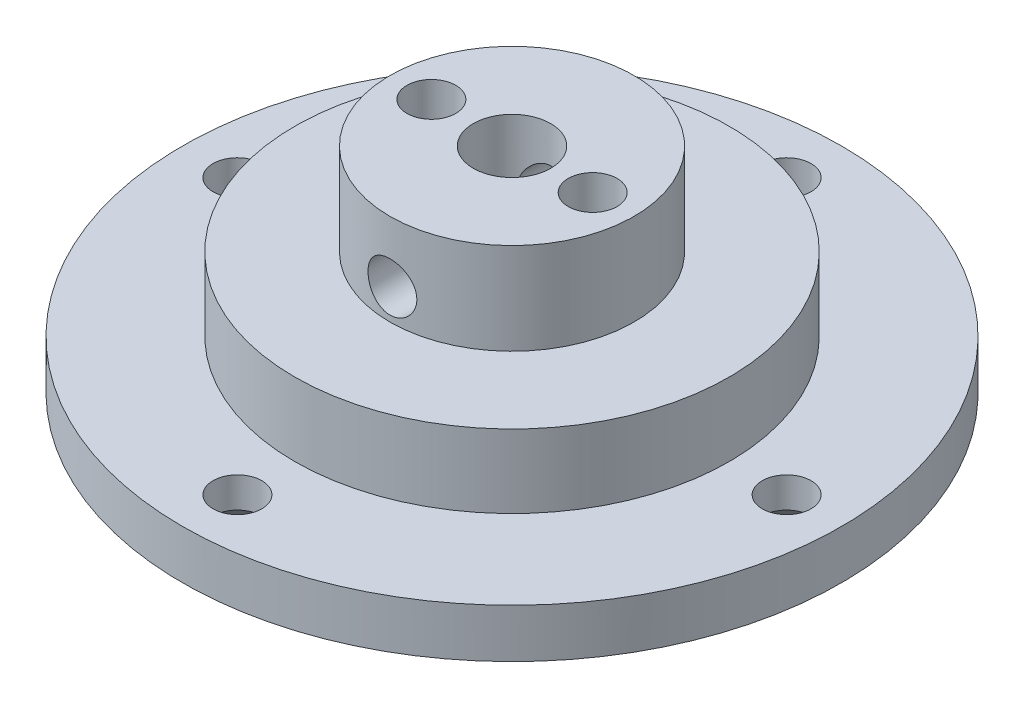
ISO-10303-21;
HEADER;
FILE_DESCRIPTION(('STEP AP214'),'2;1');
FILE_NAME('part.step','',(''),(''),'','','');
FILE_SCHEMA(('AUTOMOTIVE_DESIGN { 1 0 10303 214 1 1 1 1 }'));
ENDSEC;
DATA;
#1=APPLICATION_CONTEXT('core data for automotive mechanical design processes');
#2=APPLICATION_PROTOCOL_DEFINITION('international standard','automotive_design',2000,#1);
#3=PRODUCT_CONTEXT('',#1,'mechanical');
#4=PRODUCT('Part','Part','',(#3));
#5=PRODUCT_RELATED_PRODUCT_CATEGORY('part','',(#4));
#6=PRODUCT_DEFINITION_FORMATION('','',#4);
#7=PRODUCT_DEFINITION_CONTEXT('part definition',#1,'design');
#8=PRODUCT_DEFINITION('design','',#6,#7);
#9=PRODUCT_DEFINITION_SHAPE('','',#8);
#10=(LENGTH_UNIT() NAMED_UNIT(*) SI_UNIT(.MILLI.,.METRE.));
#11=(NAMED_UNIT(*) PLANE_ANGLE_UNIT() SI_UNIT($,.RADIAN.));
#12=(NAMED_UNIT(*) SI_UNIT($,.STERADIAN.) SOLID_ANGLE_UNIT());
#13=UNCERTAINTY_MEASURE_WITH_UNIT(LENGTH_MEASURE(1.E-05),#10,'distance_accuracy_value','');
#14=(GEOMETRIC_REPRESENTATION_CONTEXT(3) GLOBAL_UNCERTAINTY_ASSIGNED_CONTEXT((#13)) GLOBAL_UNIT_ASSIGNED_CONTEXT((#10,
#11,#12)) REPRESENTATION_CONTEXT('',''));
#15=CARTESIAN_POINT('',(0.,0.,0.));
#16=DIRECTION('',(0.,0.,1.));
#17=DIRECTION('',(1.,0.,0.));
#18=AXIS2_PLACEMENT_3D('',#15,#16,#17);
#19=CARTESIAN_POINT('',(0.,16.,0.));
#20=DIRECTION('',(0.,-1.,0.));
#21=DIRECTION('',(0.,0.,-1.));
#22=AXIS2_PLACEMENT_3D('',#19,#20,#21);
#23=CYLINDRICAL_SURFACE('',#22,27.);
#24=CARTESIAN_POINT('',(0.,2.5,0.));
#25=DIRECTION('',(0.,1.,0.));
#26=DIRECTION('',(0.,0.,1.));
#27=AXIS2_PLACEMENT_3D('',#24,#25,#26);
#28=CIRCLE('',#27,27.);
#29=CARTESIAN_POINT('',(0.,2.5,27.));
#30=VERTEX_POINT('',#29);
#31=EDGE_CURVE('E149',#30,#30,#28,.T.);
#32=ORIENTED_EDGE('',*,*,#31,.F.);
#33=EDGE_LOOP('',(#32));
#34=FACE_BOUND('',#33,.T.);
#35=CARTESIAN_POINT('',(0.,-1.5,0.));
#36=DIRECTION('',(0.,-1.,0.));
#37=DIRECTION('',(0.,0.,-1.));
#38=AXIS2_PLACEMENT_3D('',#35,#36,#37);
#39=CIRCLE('',#38,27.);
#40=CARTESIAN_POINT('',(0.,-1.5,-27.));
#41=VERTEX_POINT('',#40);
#42=EDGE_CURVE('E73',#41,#41,#39,.T.);
#43=ORIENTED_EDGE('',*,*,#42,.F.);
#44=EDGE_LOOP('',(#43));
#45=FACE_BOUND('',#44,.T.);
#46=ADVANCED_FACE('F29',(#34,#45),#23,.T.);
#47=CARTESIAN_POINT('',(0.,8.5,0.));
#48=DIRECTION('',(0.,1.,0.));
#49=DIRECTION('',(0.,0.,1.));
#50=AXIS2_PLACEMENT_3D('',#47,#48,#49);
#51=PLANE('',#50);
#52=CARTESIAN_POINT('',(0.,8.5,0.));
#53=DIRECTION('',(0.,1.,0.));
#54=DIRECTION('',(0.,0.,1.));
#55=AXIS2_PLACEMENT_3D('',#52,#53,#54);
#56=CIRCLE('',#55,10.);
#57=CARTESIAN_POINT('',(0.,8.5,10.));
#58=VERTEX_POINT('',#57);
#59=EDGE_CURVE('E141',#58,#58,#56,.T.);
#60=ORIENTED_EDGE('',*,*,#59,.F.);
#61=EDGE_LOOP('',(#60));
#62=FACE_BOUND('',#61,.T.);
#63=CARTESIAN_POINT('',(0.,8.5,0.));
#64=DIRECTION('',(0.,1.,0.));
#65=DIRECTION('',(0.,0.,1.));
#66=AXIS2_PLACEMENT_3D('',#63,#64,#65);
#67=CIRCLE('',#66,17.8);
#68=CARTESIAN_POINT('',(0.,8.5,17.8));
#69=VERTEX_POINT('',#68);
#70=EDGE_CURVE('E144',#69,#69,#67,.T.);
#71=ORIENTED_EDGE('',*,*,#70,.T.);
#72=EDGE_LOOP('',(#71));
#73=FACE_BOUND('',#72,.T.);
#74=ADVANCED_FACE('F127',(#62,#73),#51,.T.);
#75=CARTESIAN_POINT('',(0.,16.,0.));
#76=DIRECTION('',(0.,-1.,0.));
#77=DIRECTION('',(0.,0.,-1.));
#78=AXIS2_PLACEMENT_3D('',#75,#76,#77);
#79=CYLINDRICAL_SURFACE('',#78,3.175);
#80=CARTESIAN_POINT('',(0.,13.,-3.175));
#81=CARTESIAN_POINT('',(-0.101476525037058,12.9999915738684,-3.17499226289299));
#82=CARTESIAN_POINT('',(-0.203070052510219,12.9922243293759,-3.17008417823695));
#83=CARTESIAN_POINT('',(-0.403126766571678,12.9615745462042,-3.15091460168315));
#84=CARTESIAN_POINT('',(-0.501584012256517,12.9386649238897,-3.13663635064563));
#85=CARTESIAN_POINT('',(-0.692090634849497,12.8790753842645,-3.10016098732322));
#86=CARTESIAN_POINT('',(-0.784169067111647,12.8424635448291,-3.07800305101176));
#87=CARTESIAN_POINT('',(-0.960549971137719,12.7569746718291,-3.02760547522689));
#88=CARTESIAN_POINT('',(-1.04485310574213,12.7080986851016,-2.99936635485732));
#89=CARTESIAN_POINT('',(-1.2109639704167,12.5951346292733,-2.93644329633053));
#90=CARTESIAN_POINT('',(-1.29202459435627,12.5301387524063,-2.90142355627336));
#91=CARTESIAN_POINT('',(-1.44281789047478,12.3888742010404,-2.82946962284188));
#92=CARTESIAN_POINT('',(-1.51253493436166,12.3125902462452,-2.79253287918862));
#93=CARTESIAN_POINT('',(-1.64846069913404,12.1385956769623,-2.71479906783721));
#94=CARTESIAN_POINT('',(-1.71285716373584,12.0393809282853,-2.67417281468809));
#95=CARTESIAN_POINT('',(-1.82388334104334,11.8291657733324,-2.59972200280474));
#96=CARTESIAN_POINT('',(-1.87054322812345,11.7181857978822,-2.56588593898158));
#97=CARTESIAN_POINT('',(-1.93404005976775,11.5171939413814,-2.51818564470656));
#98=CARTESIAN_POINT('',(-1.95549189401937,11.4293358645121,-2.50140969328061));
#99=CARTESIAN_POINT('',(-1.9863405193127,11.2503385388876,-2.47698936531946));
#100=CARTESIAN_POINT('',(-1.99575475877688,11.1592042365963,-2.46933177288691));
#101=CARTESIAN_POINT('',(-2.00196100490322,10.9759576185273,-2.46430468488944));
#102=CARTESIAN_POINT('',(-1.99871804869056,10.8838432956427,-2.46696368665383));
#103=CARTESIAN_POINT('',(-1.97975435108006,10.701720479503,-2.48220365208432));
#104=CARTESIAN_POINT('',(-1.96402350468153,10.6117137524284,-2.49479265089232));
#105=CARTESIAN_POINT('',(-1.92154408819563,10.4383552262731,-2.52764357716514));
#106=CARTESIAN_POINT('',(-1.89508126789267,10.354893221663,-2.54770547926273));
#107=CARTESIAN_POINT('',(-1.83220192270645,10.1934318752372,-2.59329248142859));
#108=CARTESIAN_POINT('',(-1.79578189681142,10.1154344669459,-2.61881950237853));
#109=CARTESIAN_POINT('',(-1.70611370468259,9.95143635722466,-2.67828449369144));
#110=CARTESIAN_POINT('',(-1.65098588782389,9.86670982353849,-2.712900245592));
#111=CARTESIAN_POINT('',(-1.52895400605439,9.70677368229887,-2.78350606267571));
#112=CARTESIAN_POINT('',(-1.46203770576499,9.63157410364516,-2.81949752503149));
#113=CARTESIAN_POINT('',(-1.30487665200941,9.47974505690309,-2.89599631992292));
#114=CARTESIAN_POINT('',(-1.21259971177505,9.40505594095576,-2.93622794327932));
#115=CARTESIAN_POINT('',(-1.01448876791333,9.27228293876362,-3.01041623037065));
#116=CARTESIAN_POINT('',(-0.908659634525412,9.21419311136341,-3.04437513767011));
#117=CARTESIAN_POINT('',(-0.691622427030107,9.11986385845807,-3.1006744181714));
#118=CARTESIAN_POINT('',(-0.580977452615208,9.08264796143226,-3.12352576206067));
#119=CARTESIAN_POINT('',(-0.353219543278324,9.02797212410483,-3.15737991805264));
#120=CARTESIAN_POINT('',(-0.23611632638235,9.01048330675241,-3.16840004787418));
#121=CARTESIAN_POINT('',(-0.0180413733491916,8.99756070451699,-3.1765355644463));
#122=CARTESIAN_POINT('',(0.0826993681605531,8.99919818567427,-3.17549752338765));
#123=CARTESIAN_POINT('',(0.282251535700953,9.01748525155895,-3.16400646666093));
#124=CARTESIAN_POINT('',(0.381063114978562,9.03413363886638,-3.15355420196555));
#125=CARTESIAN_POINT('',(0.569785789390975,9.08052175099713,-3.12485337509414));
#126=CARTESIAN_POINT('',(0.659896585711474,9.10967756599563,-3.10695351243135));
#127=CARTESIAN_POINT('',(0.833839239568702,9.17969535941149,-3.06485767127365));
#128=CARTESIAN_POINT('',(0.917670073048523,9.22055924181343,-3.04066066878657));
#129=CARTESIAN_POINT('',(1.08579010212587,9.31732672258559,-2.98501096062797));
#130=CARTESIAN_POINT('',(1.16928557007131,9.37432618195949,-2.95307446884992));
#131=CARTESIAN_POINT('',(1.32610017982497,9.49948604525303,-2.88606502180744));
#132=CARTESIAN_POINT('',(1.39940803331593,9.56765865013628,-2.85098865705074));
#133=CARTESIAN_POINT('',(1.5450195333334,9.72483957438977,-2.77510866590551));
#134=CARTESIAN_POINT('',(1.61557264573246,9.81543821418124,-2.73422493399918));
#135=CARTESIAN_POINT('',(1.74075576106748,10.0085425655102,-2.65628150074483));
#136=CARTESIAN_POINT('',(1.79539548284394,10.1110409557417,-2.61921947432595));
#137=CARTESIAN_POINT('',(1.87731719418663,10.3041017371923,-2.56091666468433));
#138=CARTESIAN_POINT('',(1.90792193981148,10.3927367080239,-2.5379888591193));
#139=CARTESIAN_POINT('',(1.95660261704509,10.5750569027745,-2.50065678385652));
#140=CARTESIAN_POINT('',(1.97469844769937,10.6687338488617,-2.48623898190295));
#141=CARTESIAN_POINT('',(1.99736898375345,10.8593757964664,-2.46807030692743));
#142=CARTESIAN_POINT('',(2.00186040231689,10.9563573904095,-2.46438514488327));
#143=CARTESIAN_POINT('',(1.99673295842469,11.1497139848567,-2.46854006574368));
#144=CARTESIAN_POINT('',(1.98711028907932,11.2460888146605,-2.47638325810819));
#145=CARTESIAN_POINT('',(1.95590161091486,11.4267584358958,-2.50108241635968));
#146=CARTESIAN_POINT('',(1.9354349287763,11.5113727596774,-2.51709058194002));
#147=CARTESIAN_POINT('',(1.88430589785023,11.6758845942376,-2.55558918617021));
#148=CARTESIAN_POINT('',(1.85363913716578,11.7557800462964,-2.57808242928518));
#149=CARTESIAN_POINT('',(1.77802954743066,11.9208620212196,-2.63090189354455));
#150=CARTESIAN_POINT('',(1.73167768941996,12.0051882645014,-2.66188689358514));
#151=CARTESIAN_POINT('',(1.62798716761765,12.1656760953991,-2.72654071214852));
#152=CARTESIAN_POINT('',(1.57063976998898,12.2418311170513,-2.76021165163326));
#153=CARTESIAN_POINT('',(1.43290771955615,12.3999635167176,-2.83455450899614));
#154=CARTESIAN_POINT('',(1.35021039869714,12.4799370514052,-2.87524740651978));
#155=CARTESIAN_POINT('',(1.17116070071825,12.625330698229,-2.9527186029575));
#156=CARTESIAN_POINT('',(1.07479913792041,12.6907409436617,-2.98949423916137));
#157=CARTESIAN_POINT('',(0.869021324089803,12.805194128567,-3.05567422341638));
#158=CARTESIAN_POINT('',(0.759495717250583,12.8540849770325,-3.08500948592018));
#159=CARTESIAN_POINT('',(0.588629915706879,12.9123666835811,-3.12050401388052));
#160=CARTESIAN_POINT('',(0.530633997223153,12.9292762893588,-3.13091186629432));
#161=CARTESIAN_POINT('',(0.412912445199532,12.9578460555983,-3.14859608649339));
#162=CARTESIAN_POINT('',(0.353188086098299,12.9695099839518,-3.15587470179684));
#163=CARTESIAN_POINT('',(0.244573633037735,12.9855912771478,-3.16593862131482));
#164=CARTESIAN_POINT('',(0.195881568934531,12.9909865535109,-3.1693284738155));
#165=CARTESIAN_POINT('',(0.0981354745406985,12.9981930587294,-3.17386110076005));
#166=CARTESIAN_POINT('',(0.0490814230021905,13.0000040754897,-3.1750037422273));
#167=CARTESIAN_POINT('',(0.,13.,-3.175));
#168=B_SPLINE_CURVE_WITH_KNOTS('',3,(#80,#81,#82,#83,#84,#85,#86,#87,#88,#89,#90,#91,#92,#93,
#94,#95,#96,#97,#98,#99,#100,#101,#102,#103,#104,#105,#106,#107,#108,#109,#110,#111,#112,#113,
#114,#115,#116,#117,#118,#119,#120,#121,#122,#123,#124,#125,#126,#127,#128,#129,#130,#131,#132,
#133,#134,#135,#136,#137,#138,#139,#140,#141,#142,#143,#144,#145,#146,#147,#148,#149,#150,#151,
#152,#153,#154,#155,#156,#157,#158,#159,#160,#161,#162,#163,#164,#165,#166,#167),.UNSPECIFIED.,
.T.,.F.,(4,2,2,2,2,2,2,2,2,2,2,2,2,2,2,2,2,2,2,2,2,2,2,2,2,2,2,2,2,2,2,2,2,2,2,2,2,2,2,2,2,2,2,
4),(0.,0.304232392052239,0.609010411584713,0.912293856546583,1.21555142279238,1.5432197260186,
1.87133571080326,2.24473770562467,2.61750157607975,2.89230792913177,3.16671549876435,
3.44188159806796,3.7172705846124,3.9857637675447,4.25435147593007,4.57371032212574,
4.89340260802561,5.26757704232499,5.64161738528108,5.99627086908168,6.35040452472408,
6.65112338712867,6.95181826331198,7.23978633358548,7.52780126029116,7.84463984501204,
8.16182674815677,8.52590386283171,8.88975815489272,9.17822046878512,9.46622283736116,
9.75598484184772,10.0458250160945,10.310328368308,10.5749462767354,10.8771490479437,
11.1795928629566,11.5440020655339,11.9086574109828,12.2765839914835,12.4602144397249,
12.6437127774711,12.7908529677973,12.9380018647449),.UNSPECIFIED.);
#169=CARTESIAN_POINT('',(0.,13.,-3.175));
#170=VERTEX_POINT('',#169);
#171=EDGE_CURVE('E84',#170,#170,#168,.T.);
#172=ORIENTED_EDGE('',*,*,#171,.F.);
#173=EDGE_LOOP('',(#172));
#174=FACE_BOUND('',#173,.T.);
#175=CARTESIAN_POINT('',(2.,11.,2.46589233341604));
#176=CARTESIAN_POINT('',(1.99999090158307,10.9008121178509,2.46590687164989));
#177=CARTESIAN_POINT('',(1.9925536419842,10.8014773114058,2.47198953142156));
#178=CARTESIAN_POINT('',(1.96334438043011,10.6061789343688,2.49524014742493));
#179=CARTESIAN_POINT('',(1.94153476252968,10.5102249082328,2.5124371904098));
#180=CARTESIAN_POINT('',(1.88515417849698,10.3251067516494,2.55500319811643));
#181=CARTESIAN_POINT('',(1.85069534429532,10.2358910234587,2.58030011523295));
#182=CARTESIAN_POINT('',(1.77032033876273,10.0646251065505,2.63609187757525));
#183=CARTESIAN_POINT('',(1.72440354202476,9.98257530929943,2.6665870065049));
#184=CARTESIAN_POINT('',(1.6151131148495,9.81565471536749,2.73435683466109));
#185=CARTESIAN_POINT('',(1.55021188168997,9.73192873199768,2.77198866486862));
#186=CARTESIAN_POINT('',(1.40791024232801,9.57557920449064,2.84690922798005));
#187=CARTESIAN_POINT('',(1.33049894830133,9.50296543976058,2.88419763183758));
#188=CARTESIAN_POINT('',(1.15382928830773,9.36202534392064,2.9596653628844));
#189=CARTESIAN_POINT('',(1.05305412708492,9.2953310027588,2.99738787005934));
#190=CARTESIAN_POINT('',(0.838882665819289,9.18038534561243,3.06421878624734));
#191=CARTESIAN_POINT('',(0.725499183209441,9.13211551691631,3.09333583523651));
#192=CARTESIAN_POINT('',(0.501636542567057,9.06074636226975,3.13697638087595));
#193=CARTESIAN_POINT('',(0.392059062213933,9.03556810583955,3.15269324317928));
#194=CARTESIAN_POINT('',(0.169236171802992,9.00400922264309,3.17245084687623));
#195=CARTESIAN_POINT('',(0.0559948344845473,8.99760840271127,3.17650413113629));
#196=CARTESIAN_POINT('',(-0.154255549185674,9.00357009604026,3.17275329757652));
#197=CARTESIAN_POINT('',(-0.251373835698511,9.01349470905445,3.16648964520068));
#198=CARTESIAN_POINT('',(-0.44224322559198,9.04710237016993,3.14551442421494));
#199=CARTESIAN_POINT('',(-0.535994074117976,9.07078645729669,3.13080221762646));
#200=CARTESIAN_POINT('',(-0.717984024194784,9.130853501839,3.09415071444281));
#201=CARTESIAN_POINT('',(-0.806212463238679,9.16726018290617,3.07219792074763));
#202=CARTESIAN_POINT('',(-0.975368780987803,9.25140371524957,3.02275640850583));
#203=CARTESIAN_POINT('',(-1.05629503454699,9.29914308014246,2.99526646201054));
#204=CARTESIAN_POINT('',(-1.21943747594383,9.41130090767886,2.93294126085738));
#205=CARTESIAN_POINT('',(-1.30054359212299,9.47706003450052,2.89761720617172));
#206=CARTESIAN_POINT('',(-1.4512799603457,9.61992994439761,2.82514149894608));
#207=CARTESIAN_POINT('',(-1.52089302720385,9.69705740602732,2.78798721551571));
#208=CARTESIAN_POINT('',(-1.65612458954927,9.87256118271289,2.71011707591775));
#209=CARTESIAN_POINT('',(-1.7199689069034,9.97239964179924,2.66958799068782));
#210=CARTESIAN_POINT('',(-1.82974873770082,10.183825739658,2.59558100723155));
#211=CARTESIAN_POINT('',(-1.87571709410986,10.2953913486223,2.56209023028312));
#212=CARTESIAN_POINT('',(-1.93775638466416,10.4969392642397,2.51531617850959));
#213=CARTESIAN_POINT('',(-1.95852685715628,10.5847732215038,2.49902766236284));
#214=CARTESIAN_POINT('',(-1.98803686574072,10.7635866570256,2.47562154575213));
#215=CARTESIAN_POINT('',(-1.99679334625848,10.8545615192124,2.46849102983714));
#216=CARTESIAN_POINT('',(-2.0017450649925,11.0373153063877,2.46447872389607));
#217=CARTESIAN_POINT('',(-1.9979089407605,11.1290956702927,2.46762252242586));
#218=CARTESIAN_POINT('',(-1.97786837759876,11.3104435614814,2.48371009581809));
#219=CARTESIAN_POINT('',(-1.96165364262213,11.400009182571,2.49666202863283));
#220=CARTESIAN_POINT('',(-1.91822272714689,11.5729050230213,2.53017198569149));
#221=CARTESIAN_POINT('',(-1.89123132126453,11.6563237258363,2.55057392081974));
#222=CARTESIAN_POINT('',(-1.82729727674056,11.8176318613944,2.5967598628512));
#223=CARTESIAN_POINT('',(-1.79035113558979,11.8955193357998,2.62254576334767));
#224=CARTESIAN_POINT('',(-1.69940280298898,12.0594455920622,2.68256552397718));
#225=CARTESIAN_POINT('',(-1.64348767446577,12.144176981958,2.71747074073631));
#226=CARTESIAN_POINT('',(-1.51980983064632,12.3039955853598,2.78853043345476));
#227=CARTESIAN_POINT('',(-1.45203469497722,12.3790725438497,2.82468618686872));
#228=CARTESIAN_POINT('',(-1.29321556579375,12.5302027864653,2.90124443899629));
#229=CARTESIAN_POINT('',(-1.20017608365051,12.6043337348264,2.94135053658763));
#230=CARTESIAN_POINT('',(-1.00058271415417,12.7358250540181,3.01508805876786));
#231=CARTESIAN_POINT('',(-0.894034531255205,12.793192470155,3.04872220132707));
#232=CARTESIAN_POINT('',(-0.67623708714338,12.8857062498323,3.10406504559704));
#233=CARTESIAN_POINT('',(-0.565593936901231,12.921925320989,3.12634034643211));
#234=CARTESIAN_POINT('',(-0.338072588277098,12.9746612560074,3.15903052520699));
#235=CARTESIAN_POINT('',(-0.221203601178509,12.9912064260644,3.16946244205744));
#236=CARTESIAN_POINT('',(-0.00370360004249617,13.0025037493781,3.17657698775842));
#237=CARTESIAN_POINT('',(0.0967285763712691,13.0001570342431,3.17509009682145));
#238=CARTESIAN_POINT('',(0.295535142234609,12.9805626464353,3.16278250971577));
#239=CARTESIAN_POINT('',(0.393909654215256,12.963315863643,3.1519623709591));
#240=CARTESIAN_POINT('',(0.582044526850574,12.9157983378102,3.12259148430048));
#241=CARTESIAN_POINT('',(0.671990954202438,12.8860579359412,3.10435640474158));
#242=CARTESIAN_POINT('',(0.84552136957005,12.8149090119943,3.06165173262775));
#243=CARTESIAN_POINT('',(0.929104330608651,12.7734986115858,3.03718113650346));
#244=CARTESIAN_POINT('',(1.09682917033282,12.6755134032152,2.98097204520092));
#245=CARTESIAN_POINT('',(1.18015114141815,12.6178196930463,2.9487458132924));
#246=CARTESIAN_POINT('',(1.33651724175415,12.4912606018951,2.88125249547953));
#247=CARTESIAN_POINT('',(1.40954977073001,12.4223827972921,2.84598204861994));
#248=CARTESIAN_POINT('',(1.55440775753217,12.2637249781025,2.7698507855398));
#249=CARTESIAN_POINT('',(1.62447501319413,12.172360645218,2.7289308928647));
#250=CARTESIAN_POINT('',(1.7485450697099,11.977694131497,2.65114675676971));
#251=CARTESIAN_POINT('',(1.8025556585872,11.8743977719655,2.61428055266027));
#252=CARTESIAN_POINT('',(1.88266715338775,11.6811688175036,2.55696429777707));
#253=CARTESIAN_POINT('',(1.91228650728714,11.5932388013139,2.53468748304013));
#254=CARTESIAN_POINT('',(1.95918298190396,11.4126062745183,2.49862393814564));
#255=CARTESIAN_POINT('',(1.97649846504645,11.3199195726376,2.48481083755828));
#256=CARTESIAN_POINT('',(1.99143909378843,11.1886737259825,2.4728157656299));
#257=CARTESIAN_POINT('',(1.99464365408458,11.1510679682801,2.47022888515031));
#258=CARTESIAN_POINT('',(1.99892612529295,11.0756486347308,2.46676416897308));
#259=CARTESIAN_POINT('',(2.00000347057175,11.0378350062899,2.46588678783771));
#260=CARTESIAN_POINT('',(2.,11.,2.46589233341604));
#261=B_SPLINE_CURVE_WITH_KNOTS('',3,(#175,#176,#177,#178,#179,#180,#181,#182,#183,#184,#185,
#186,#187,#188,#189,#190,#191,#192,#193,#194,#195,#196,#197,#198,#199,#200,#201,#202,#203,#204,
#205,#206,#207,#208,#209,#210,#211,#212,#213,#214,#215,#216,#217,#218,#219,#220,#221,#222,#223,
#224,#225,#226,#227,#228,#229,#230,#231,#232,#233,#234,#235,#236,#237,#238,#239,#240,#241,#242,
#243,#244,#245,#246,#247,#248,#249,#250,#251,#252,#253,#254,#255,#256,#257,#258,#259,#260),
.UNSPECIFIED.,.T.,.F.,(4,2,2,2,2,2,2,2,2,2,2,2,2,2,2,2,2,2,2,2,2,2,2,2,2,2,2,2,2,2,2,2,2,2,2,2,
2,2,2,2,2,2,4),(0.,0.297390063211998,0.595561576120619,0.891151308846726,1.18675717920223,
1.52272996686637,1.85899675073441,2.23671629365682,2.61405530348635,2.95256646392934,
3.29071345739769,3.58278352564361,3.87487565197759,4.16751537076875,4.46022005850385,
4.78961837931241,5.11950486335608,5.49343471910718,5.86667428178836,6.14067589769239,
6.41429066555722,6.68858739981657,6.96311253233839,7.23218817708664,7.50135861826526,
7.82222461620282,8.14342867377716,8.51816120636343,8.89273602068741,9.24613904454614,
9.59903298554898,9.89889959611244,10.1987482989024,10.486982759039,10.7752636381332,
11.0930768355032,11.4112455151164,11.7762214928024,12.1410201549523,12.4262141773566,
12.7105150401276,12.8239236943697,12.9373625002841),.UNSPECIFIED.);
#262=CARTESIAN_POINT('',(2.,11.,2.46589233341604));
#263=VERTEX_POINT('',#262);
#264=EDGE_CURVE('E77',#263,#263,#261,.T.);
#265=ORIENTED_EDGE('',*,*,#264,.F.);
#266=EDGE_LOOP('',(#265));
#267=FACE_BOUND('',#266,.T.);
#268=CARTESIAN_POINT('',(0.,16.,0.));
#269=DIRECTION('',(0.,1.,0.));
#270=DIRECTION('',(0.,0.,1.));
#271=AXIS2_PLACEMENT_3D('',#268,#269,#270);
#272=CIRCLE('',#271,3.175);
#273=CARTESIAN_POINT('',(0.,16.,3.175));
#274=VERTEX_POINT('',#273);
#275=EDGE_CURVE('E159',#274,#274,#272,.T.);
#276=ORIENTED_EDGE('',*,*,#275,.T.);
#277=EDGE_LOOP('',(#276));
#278=FACE_BOUND('',#277,.T.);
#279=CARTESIAN_POINT('',(0.,6.,0.));
#280=DIRECTION('',(0.,-1.,0.));
#281=DIRECTION('',(0.,0.,-1.));
#282=AXIS2_PLACEMENT_3D('',#279,#280,#281);
#283=CIRCLE('',#282,3.175);
#284=CARTESIAN_POINT('',(0.,6.,-3.175));
#285=VERTEX_POINT('',#284);
#286=EDGE_CURVE('E157',#285,#285,#283,.T.);
#287=ORIENTED_EDGE('',*,*,#286,.T.);
#288=EDGE_LOOP('',(#287));
#289=FACE_BOUND('',#288,.T.);
#290=ADVANCED_FACE('F89',(#174,#267,#278,#289),#79,.F.);
#291=CARTESIAN_POINT('',(0.,16.,0.));
#292=DIRECTION('',(0.,1.,0.));
#293=DIRECTION('',(0.,0.,1.));
#294=AXIS2_PLACEMENT_3D('',#291,#292,#293);
#295=PLANE('',#294);
#296=CARTESIAN_POINT('',(6.60744302974954,16.,0.));
#297=DIRECTION('',(0.,1.,0.));
#298=DIRECTION('',(0.,0.,-1.));
#299=AXIS2_PLACEMENT_3D('',#296,#297,#298);
#300=CIRCLE('',#299,2.);
#301=CARTESIAN_POINT('',(6.60744302974954,16.,-2.));
#302=VERTEX_POINT('',#301);
#303=EDGE_CURVE('E59',#302,#302,#300,.T.);
#304=ORIENTED_EDGE('',*,*,#303,.F.);
#305=EDGE_LOOP('',(#304));
#306=FACE_BOUND('',#305,.T.);
#307=CARTESIAN_POINT('',(-6.60744302974954,16.,0.));
#308=DIRECTION('',(0.,1.,0.));
#309=DIRECTION('',(0.,0.,1.));
#310=AXIS2_PLACEMENT_3D('',#307,#308,#309);
#311=CIRCLE('',#310,2.);
#312=CARTESIAN_POINT('',(-6.60744302974954,16.,2.));
#313=VERTEX_POINT('',#312);
#314=EDGE_CURVE('E48',#313,#313,#311,.T.);
#315=ORIENTED_EDGE('',*,*,#314,.F.);
#316=EDGE_LOOP('',(#315));
#317=FACE_BOUND('',#316,.T.);
#318=ORIENTED_EDGE('',*,*,#275,.F.);
#319=EDGE_LOOP('',(#318));
#320=FACE_BOUND('',#319,.T.);
#321=CARTESIAN_POINT('',(0.,16.,0.));
#322=DIRECTION('',(0.,1.,0.));
#323=DIRECTION('',(0.,0.,1.));
#324=AXIS2_PLACEMENT_3D('',#321,#322,#323);
#325=CIRCLE('',#324,10.);
#326=CARTESIAN_POINT('',(0.,16.,10.));
#327=VERTEX_POINT('',#326);
#328=EDGE_CURVE('E160',#327,#327,#325,.T.);
#329=ORIENTED_EDGE('',*,*,#328,.T.);
#330=EDGE_LOOP('',(#329));
#331=FACE_BOUND('',#330,.T.);
#332=ADVANCED_FACE('F124',(#306,#317,#320,#331),#295,.T.);
#333=CARTESIAN_POINT('',(0.,8.5,0.));
#334=DIRECTION('',(0.,1.,0.));
#335=DIRECTION('',(0.,0.,1.));
#336=AXIS2_PLACEMENT_3D('',#333,#334,#335);
#337=CYLINDRICAL_SURFACE('',#336,10.);
#338=CARTESIAN_POINT('',(0.,9.,10.));
#339=CARTESIAN_POINT('',(0.111153813585266,9.00000408899669,9.99999795161742));
#340=CARTESIAN_POINT('',(0.222359320403044,9.00929768593529,9.99812770356462));
#341=CARTESIAN_POINT('',(0.441627015378038,9.04619700023049,9.99084731246463));
#342=CARTESIAN_POINT('',(0.549686635082712,9.07381726560302,9.98543435720372));
#343=CARTESIAN_POINT('',(0.759460610526626,9.14648254724158,9.97167298556573));
#344=CARTESIAN_POINT('',(0.861180935866268,9.19151087368938,9.96332738153436));
#345=CARTESIAN_POINT('',(1.05561597772845,9.29766449502259,9.94460796070629));
#346=CARTESIAN_POINT('',(1.14833123015162,9.35878883121441,9.93423426471414));
#347=CARTESIAN_POINT('',(1.32338695462973,9.49627698858287,9.9124433065994));
#348=CARTESIAN_POINT('',(1.40558790231705,9.5728167107824,9.90101491008695));
#349=CARTESIAN_POINT('',(1.55607351321606,9.7385848327834,9.87848360905177));
#350=CARTESIAN_POINT('',(1.62435708954085,9.82781422267024,9.86738073000848));
#351=CARTESIAN_POINT('',(1.74566350669524,10.0174323860238,9.8466488362523));
#352=CARTESIAN_POINT('',(1.79854187773173,10.1179152875927,9.83703414729892));
#353=CARTESIAN_POINT('',(1.88661133316062,10.3265636380082,9.82052536116836));
#354=CARTESIAN_POINT('',(1.92180416487448,10.4347283266927,9.81363099523923));
#355=CARTESIAN_POINT('',(1.97305059976965,10.6541687278158,9.80345610504409));
#356=CARTESIAN_POINT('',(1.98934899591755,10.7653850882845,9.80012940214375));
#357=CARTESIAN_POINT('',(2.00310425545224,10.9890196427287,9.79732750121254));
#358=CARTESIAN_POINT('',(2.000563045427,11.1014377126403,9.79785190935681));
#359=CARTESIAN_POINT('',(1.97690914620364,11.322493576042,9.80265102296369));
#360=CARTESIAN_POINT('',(1.95607708048781,11.4311628112546,9.80686905717527));
#361=CARTESIAN_POINT('',(1.8968757692461,11.643432153326,9.81849092320002));
#362=CARTESIAN_POINT('',(1.85850568620136,11.747032017838,9.82589490715558));
#363=CARTESIAN_POINT('',(1.76504956734944,11.9470305234072,9.84311237000816));
#364=CARTESIAN_POINT('',(1.70985230246423,12.0433757591383,9.85294179627409));
#365=CARTESIAN_POINT('',(1.58438714914536,12.2255416999456,9.87389237546124));
#366=CARTESIAN_POINT('',(1.51411752871366,12.3113611937023,9.88501367676732));
#367=CARTESIAN_POINT('',(1.35899986912117,12.4716588049139,9.90754042482924));
#368=CARTESIAN_POINT('',(1.27391232242489,12.5459051357183,9.9189473842181));
#369=CARTESIAN_POINT('',(1.09237004812402,12.6791076926024,9.94057697428817));
#370=CARTESIAN_POINT('',(0.995915174758778,12.7380637225872,9.95079958977947));
#371=CARTESIAN_POINT('',(0.794118773757842,12.839055018452,9.96893380321774));
#372=CARTESIAN_POINT('',(0.6887636391706,12.8810637872891,9.97684177696544));
#373=CARTESIAN_POINT('',(0.47229795289733,12.9467209480771,9.98942817975716));
#374=CARTESIAN_POINT('',(0.361188100144899,12.9703715641473,9.99410700001063));
#375=CARTESIAN_POINT('',(0.138358811254301,12.9983129075886,9.99965343733735));
#376=CARTESIAN_POINT('',(0.0266806566511523,13.0029208390805,10.0005834930494));
#377=CARTESIAN_POINT('',(-0.195849868385428,12.9935002821156,9.99870103860205));
#378=CARTESIAN_POINT('',(-0.306702284887586,12.9794728412948,9.99588873882892));
#379=CARTESIAN_POINT('',(-0.523411319893082,12.9334432529121,9.98687664016035));
#380=CARTESIAN_POINT('',(-0.629303896679806,12.9016038630042,9.98070752808413));
#381=CARTESIAN_POINT('',(-0.834247254999334,12.8210320346884,9.96567104122065));
#382=CARTESIAN_POINT('',(-0.933297523275079,12.7722983306463,9.95680346428453));
#383=CARTESIAN_POINT('',(-1.12308234737244,12.6586350186974,9.93719823066589));
#384=CARTESIAN_POINT('',(-1.21370025350438,12.5935144379221,9.92643900874104));
#385=CARTESIAN_POINT('',(-1.38283603823841,12.4491816175854,9.90429469659765));
#386=CARTESIAN_POINT('',(-1.46135261786152,12.3699678672003,9.89290953936776));
#387=CARTESIAN_POINT('',(-1.60528118154835,12.1982532962178,9.8705860711393));
#388=CARTESIAN_POINT('',(-1.67047540489731,12.1055685115573,9.85965720466609));
#389=CARTESIAN_POINT('',(-1.78437084010241,11.9103772772866,9.83968383592389));
#390=CARTESIAN_POINT('',(-1.83307271184581,11.8078712208529,9.83063925826685));
#391=CARTESIAN_POINT('',(-1.91230368316392,11.5964635077009,9.81553481168766));
#392=CARTESIAN_POINT('',(-1.9429269995821,11.4875983175794,9.80945949744373));
#393=CARTESIAN_POINT('',(-1.98541730325439,11.2661330930182,9.8009487358405));
#394=CARTESIAN_POINT('',(-1.99728673645022,11.1535335475813,9.79851281382223));
#395=CARTESIAN_POINT('',(-2.00184182173494,10.9299822709114,9.79758299262758));
#396=CARTESIAN_POINT('',(-1.99487157614179,10.819037702146,9.79901838378602));
#397=CARTESIAN_POINT('',(-1.96270460820012,10.5999367001899,9.80551146969228));
#398=CARTESIAN_POINT('',(-1.9375080322586,10.4917802446104,9.81056913534338));
#399=CARTESIAN_POINT('',(-1.86975713699791,10.2815445775189,9.82370528438317));
#400=CARTESIAN_POINT('',(-1.82724501343469,10.1794512789952,9.83177642037661));
#401=CARTESIAN_POINT('',(-1.72610928920321,9.98379255853112,9.85003429948341));
#402=CARTESIAN_POINT('',(-1.66748433754976,9.89022785254973,9.86022121997788));
#403=CARTESIAN_POINT('',(-1.53461182957283,9.71256885569937,9.88177921046451));
#404=CARTESIAN_POINT('',(-1.46011577447036,9.62866246946481,9.89316745819399));
#405=CARTESIAN_POINT('',(-1.29812873802628,9.47442758894166,9.91572163743909));
#406=CARTESIAN_POINT('',(-1.21063477430667,9.40410221936546,9.92688751726369));
#407=CARTESIAN_POINT('',(-1.02403525817649,9.27833071210711,9.94787664775943));
#408=CARTESIAN_POINT('',(-0.924817768859669,9.22304799343995,9.95768462438492));
#409=CARTESIAN_POINT('',(-0.718332721881464,9.13002775480682,9.9747025017));
#410=CARTESIAN_POINT('',(-0.611072521726251,9.09227442093501,9.98191474277232));
#411=CARTESIAN_POINT('',(-0.419642977847558,9.04269610391057,9.99152745190741));
#412=CARTESIAN_POINT('',(-0.336563328027568,9.02671361258449,9.99468606316904));
#413=CARTESIAN_POINT('',(-0.168999050420133,9.00536417528327,9.99892308279786));
#414=CARTESIAN_POINT('',(-0.0845144674972378,8.99999689098046,10.0000015574631));
#415=CARTESIAN_POINT('',(0.,9.,10.));
#416=B_SPLINE_CURVE_WITH_KNOTS('',3,(#338,#339,#340,#341,#342,#343,#344,#345,#346,#347,#348,
#349,#350,#351,#352,#353,#354,#355,#356,#357,#358,#359,#360,#361,#362,#363,#364,#365,#366,#367,
#368,#369,#370,#371,#372,#373,#374,#375,#376,#377,#378,#379,#380,#381,#382,#383,#384,#385,#386,
#387,#388,#389,#390,#391,#392,#393,#394,#395,#396,#397,#398,#399,#400,#401,#402,#403,#404,#405,
#406,#407,#408,#409,#410,#411,#412,#413,#414,#415),.UNSPECIFIED.,.T.,.F.,(4,2,2,2,2,2,2,2,2,2,2,
2,2,2,2,2,2,2,2,2,2,2,2,2,2,2,2,2,2,2,2,2,2,2,2,2,2,2,4),(0.,0.333152261322517,
0.666569301382645,0.999667470500683,1.33274580446173,1.66986534022437,2.00701119349473,
2.34722390011846,2.68740298730395,3.02312370207175,3.3588100856245,3.68943454012557,
4.02007478507459,4.35294980407185,4.68586309499341,5.02476504982701,5.36367135079641,
5.70310549708048,6.04249851396072,6.3762147135253,6.70991215315735,7.04060907901447,
7.37133078432045,7.70610132066717,8.0409077669186,8.38081257158452,8.72070377446933,
9.05880762065447,9.3968673666083,9.72879445135403,10.0607188698522,10.3918392250622,
10.7229873516373,11.0597615247829,11.3966130906586,11.7369899335127,12.0770591103504,
12.3303755057979,12.5836838274199),.UNSPECIFIED.);
#417=CARTESIAN_POINT('',(0.,9.,10.));
#418=VERTEX_POINT('',#417);
#419=EDGE_CURVE('E85',#418,#418,#416,.T.);
#420=ORIENTED_EDGE('',*,*,#419,.F.);
#421=EDGE_LOOP('',(#420));
#422=FACE_BOUND('',#421,.T.);
#423=CARTESIAN_POINT('',(2.,11.,-9.79795897113271));
#424=CARTESIAN_POINT('',(1.99999589175054,10.8888712490177,-9.79796118053293));
#425=CARTESIAN_POINT('',(1.99070634343629,10.7776907533333,-9.79987016537404));
#426=CARTESIAN_POINT('',(1.95382456716568,10.5584749897137,-9.80728862609749));
#427=CARTESIAN_POINT('',(1.92621769414099,10.450442310728,-9.81280098289574));
#428=CARTESIAN_POINT('',(1.85359156523949,10.2407253932916,-9.82677747443709));
#429=CARTESIAN_POINT('',(1.80858962830524,10.1390349569348,-9.83523867242151));
#430=CARTESIAN_POINT('',(1.70249821534101,9.94465031060609,-9.85415598961317));
#431=CARTESIAN_POINT('',(1.6414096372023,9.8519555989242,-9.86461199746922));
#432=CARTESIAN_POINT('',(1.50395815130687,9.67687799229228,-9.88650599388505));
#433=CARTESIAN_POINT('',(1.42741131182664,9.59464082423205,-9.89795475674493));
#434=CARTESIAN_POINT('',(1.26161357804262,9.44408493284204,-9.92044944605197));
#435=CARTESIAN_POINT('',(1.17236179395597,9.37576718516561,-9.93149534421663));
#436=CARTESIAN_POINT('',(0.98272271184851,9.25442396474308,-9.95205592835124));
#437=CARTESIAN_POINT('',(0.88224513534442,9.20153697236672,-9.96155642883101));
#438=CARTESIAN_POINT('',(0.673608300774542,9.11345012590373,-9.97783473767263));
#439=CARTESIAN_POINT('',(0.565449762841105,9.07824861619802,-9.98461280088238));
#440=CARTESIAN_POINT('',(0.346033546556988,9.02698561276075,-9.99460641376837));
#441=CARTESIAN_POINT('',(0.234835478429627,9.01067804485798,-9.99786772576254));
#442=CARTESIAN_POINT('',(0.0112371368750715,8.99689809632337,-10.0006184236721));
#443=CARTESIAN_POINT('',(-0.101163019663687,8.99942390070836,-10.0001081730552));
#444=CARTESIAN_POINT('',(-0.322284001487179,9.02305236043111,-9.99540869737031));
#445=CARTESIAN_POINT('',(-0.431034428596942,9.04388995433569,-9.99127196731677));
#446=CARTESIAN_POINT('',(-0.643463253160603,9.10313006491778,-9.97984354318817));
#447=CARTESIAN_POINT('',(-0.747141447494259,9.14153328438375,-9.97255172288078));
#448=CARTESIAN_POINT('',(-0.947238926401775,9.23506008029454,-9.95554592039917));
#449=CARTESIAN_POINT('',(-1.0436083482678,9.29028750220978,-9.94581696350447));
#450=CARTESIAN_POINT('',(-1.22581009171951,9.4158181544732,-9.92500938947571));
#451=CARTESIAN_POINT('',(-1.31164119905,9.48612311954103,-9.91393061710444));
#452=CARTESIAN_POINT('',(-1.47190286210692,9.64126724421695,-9.89141928728919));
#453=CARTESIAN_POINT('',(-1.54610863314726,9.72633837345918,-9.87998392915032));
#454=CARTESIAN_POINT('',(-1.67923698635362,9.90783288490151,-9.85823143197521));
#455=CARTESIAN_POINT('',(-1.7381592794555,10.0042564817664,-9.84791431409096));
#456=CARTESIAN_POINT('',(-1.83912562960376,10.2060416636436,-9.82956094945847));
#457=CARTESIAN_POINT('',(-1.88113329555542,10.3114219352793,-9.82152963127098));
#458=CARTESIAN_POINT('',(-1.94678068325517,10.527942647448,-9.80872952642545));
#459=CARTESIAN_POINT('',(-1.97042279891329,10.6390823352382,-9.80396031456855));
#460=CARTESIAN_POINT('',(-1.9983320120721,10.8619297159981,-9.79830958535655));
#461=CARTESIAN_POINT('',(-2.00292371779582,10.9735951486207,-9.79736294114308));
#462=CARTESIAN_POINT('',(-1.99347525662148,11.1960964463994,-9.79928971377708));
#463=CARTESIAN_POINT('',(-1.97943614624488,11.3069323582377,-9.80216291400776));
#464=CARTESIAN_POINT('',(-1.93340441614831,11.5235372805845,-9.81134464989829));
#465=CARTESIAN_POINT('',(-1.9015852416786,11.6293446860715,-9.81761998028993));
#466=CARTESIAN_POINT('',(-1.82108207061703,11.8341265580575,-9.83286978703329));
#467=CARTESIAN_POINT('',(-1.77239668474635,11.9331004608714,-9.84184448572539));
#468=CARTESIAN_POINT('',(-1.65880828443119,12.1228262199003,-9.86162811924079));
#469=CARTESIAN_POINT('',(-1.59370215596551,12.2134540926017,-9.87245943729806));
#470=CARTESIAN_POINT('',(-1.44939114442542,12.3826166240018,-9.89467447653273));
#471=CARTESIAN_POINT('',(-1.37018481028907,12.4611500364985,-9.90605825447636));
#472=CARTESIAN_POINT('',(-1.19846454699578,12.6051251183712,-9.92830691738431));
#473=CARTESIAN_POINT('',(-1.10576499785926,12.6703473093,-9.93916115417367));
#474=CARTESIAN_POINT('',(-0.910535793269508,12.7842917629992,-9.9589425525724));
#475=CARTESIAN_POINT('',(-0.808006550867011,12.8330147186896,-9.96786979510422));
#476=CARTESIAN_POINT('',(-0.596605361648023,12.9122577434933,-9.98274588122133));
#477=CARTESIAN_POINT('',(-0.487773346956154,12.9428810364525,-9.98871158285205));
#478=CARTESIAN_POINT('',(-0.266378909359821,12.9853824953277,-9.99706471875323));
#479=CARTESIAN_POINT('',(-0.153816937422421,12.9972629189514,-9.99945258399698));
#480=CARTESIAN_POINT('',(0.0697457878072447,13.0018539619258,-10.0003708090823));
#481=CARTESIAN_POINT('',(0.180739624282991,12.9948945609125,-9.99896757098659));
#482=CARTESIAN_POINT('',(0.399942062631302,12.9627320989043,-9.99260087120678));
#483=CARTESIAN_POINT('',(0.508150699507447,12.9375292673037,-9.98763745428862));
#484=CARTESIAN_POINT('',(0.718505499490132,12.8697420158168,-9.97470996729841));
#485=CARTESIAN_POINT('',(0.820664886480331,12.8271972437381,-9.9667527449523));
#486=CARTESIAN_POINT('',(1.01644244037214,12.7259755173378,-9.9486944424736));
#487=CARTESIAN_POINT('',(1.11005993153569,12.667297288191,-9.93859319293976));
#488=CARTESIAN_POINT('',(1.28772778021183,12.5343612258774,-9.91715198313481));
#489=CARTESIAN_POINT('',(1.37159943222969,12.4598673272324,-9.90579466835802));
#490=CARTESIAN_POINT('',(1.52576523551701,12.2978995198025,-9.8832244581573));
#491=CARTESIAN_POINT('',(1.59605616641783,12.2104225410401,-9.87201159757438));
#492=CARTESIAN_POINT('',(1.72178443889996,12.0238413666191,-9.85086685467863));
#493=CARTESIAN_POINT('',(1.77705362923618,11.9246220777575,-9.84095007142451));
#494=CARTESIAN_POINT('',(1.87004809853245,11.7181344534798,-9.82370474252826));
#495=CARTESIAN_POINT('',(1.90778929194833,11.6108735226256,-9.81637385049968));
#496=CARTESIAN_POINT('',(1.95733827971531,11.4194750891142,-9.8065936227569));
#497=CARTESIAN_POINT('',(1.97330779704737,11.3364291609721,-9.80337569829212));
#498=CARTESIAN_POINT('',(1.99464003591942,11.1689320908977,-9.79905756918169));
#499=CARTESIAN_POINT('',(2.00000312312529,11.0844809975111,-9.79795729152836));
#500=CARTESIAN_POINT('',(2.,11.,-9.79795897113271));
#501=B_SPLINE_CURVE_WITH_KNOTS('',3,(#423,#424,#425,#426,#427,#428,#429,#430,#431,#432,#433,
#434,#435,#436,#437,#438,#439,#440,#441,#442,#443,#444,#445,#446,#447,#448,#449,#450,#451,#452,
#453,#454,#455,#456,#457,#458,#459,#460,#461,#462,#463,#464,#465,#466,#467,#468,#469,#470,#471,
#472,#473,#474,#475,#476,#477,#478,#479,#480,#481,#482,#483,#484,#485,#486,#487,#488,#489,#490,
#491,#492,#493,#494,#495,#496,#497,#498,#499,#500),.UNSPECIFIED.,.T.,.F.,(4,2,2,2,2,2,2,2,2,2,2,
2,2,2,2,2,2,2,2,2,2,2,2,2,2,2,2,2,2,2,2,2,2,2,2,2,2,2,4),(0.,0.333076927738856,
0.666420478568594,0.999432995881171,1.33242692971973,1.66964505096874,2.00688680070844,
2.347068008749,2.6872173649312,3.02288497766161,3.35852024232497,3.68937579267075,
4.02024458147501,4.35319848444606,4.68619071540132,5.02498693524967,5.36378956245441,
5.70331726345553,6.0428007003205,6.37647515609188,6.71013069056843,7.04058683566638,
7.37107020708797,7.70586119549042,8.04068665740418,8.38065203466902,8.7206031326021,
9.05859627157301,9.39654869383256,9.72862034829372,10.0606878273351,10.392000341509,
10.7233390426937,11.0600230405119,11.3967867777956,11.7371779715921,12.077259501804,
12.3304760727632,12.5836839137096),.UNSPECIFIED.);
#502=CARTESIAN_POINT('',(2.,11.,-9.79795897113271));
#503=VERTEX_POINT('',#502);
#504=EDGE_CURVE('E76',#503,#503,#501,.T.);
#505=ORIENTED_EDGE('',*,*,#504,.F.);
#506=EDGE_LOOP('',(#505));
#507=FACE_BOUND('',#506,.T.);
#508=ORIENTED_EDGE('',*,*,#59,.T.);
#509=EDGE_LOOP('',(#508));
#510=FACE_BOUND('',#509,.T.);
#511=ORIENTED_EDGE('',*,*,#328,.F.);
#512=EDGE_LOOP('',(#511));
#513=FACE_BOUND('',#512,.T.);
#514=ADVANCED_FACE('F119',(#422,#507,#510,#513),#337,.T.);
#515=CARTESIAN_POINT('',(0.,6.,0.));
#516=DIRECTION('',(0.,-1.,0.));
#517=DIRECTION('',(0.,0.,-1.));
#518=AXIS2_PLACEMENT_3D('',#515,#516,#517);
#519=CYLINDRICAL_SURFACE('',#518,15.);
#520=CARTESIAN_POINT('',(0.,6.,0.));
#521=DIRECTION('',(0.,-1.,0.));
#522=DIRECTION('',(0.,0.,-1.));
#523=AXIS2_PLACEMENT_3D('',#520,#521,#522);
#524=CIRCLE('',#523,15.);
#525=CARTESIAN_POINT('',(0.,6.,-15.));
#526=VERTEX_POINT('',#525);
#527=EDGE_CURVE('E154',#526,#526,#524,.T.);
#528=ORIENTED_EDGE('',*,*,#527,.F.);
#529=EDGE_LOOP('',(#528));
#530=FACE_BOUND('',#529,.T.);
#531=CARTESIAN_POINT('',(0.,-1.5,0.));
#532=DIRECTION('',(0.,-1.,0.));
#533=DIRECTION('',(0.,0.,-1.));
#534=AXIS2_PLACEMENT_3D('',#531,#532,#533);
#535=CIRCLE('',#534,15.);
#536=CARTESIAN_POINT('',(0.,-1.5,-15.));
#537=VERTEX_POINT('',#536);
#538=EDGE_CURVE('E70',#537,#537,#535,.T.);
#539=ORIENTED_EDGE('',*,*,#538,.T.);
#540=EDGE_LOOP('',(#539));
#541=FACE_BOUND('',#540,.T.);
#542=ADVANCED_FACE('F123',(#530,#541),#519,.F.);
#543=CARTESIAN_POINT('',(0.,6.,0.));
#544=DIRECTION('',(0.,-1.,0.));
#545=DIRECTION('',(0.,0.,-1.));
#546=AXIS2_PLACEMENT_3D('',#543,#544,#545);
#547=PLANE('',#546);
#548=CARTESIAN_POINT('',(6.60744302974954,6.,0.));
#549=DIRECTION('',(0.,-1.,0.));
#550=DIRECTION('',(0.,0.,-1.));
#551=AXIS2_PLACEMENT_3D('',#548,#549,#550);
#552=CIRCLE('',#551,2.);
#553=CARTESIAN_POINT('',(6.60744302974954,6.,-2.));
#554=VERTEX_POINT('',#553);
#555=EDGE_CURVE('E33',#554,#554,#552,.T.);
#556=ORIENTED_EDGE('',*,*,#555,.F.);
#557=EDGE_LOOP('',(#556));
#558=FACE_BOUND('',#557,.T.);
#559=CARTESIAN_POINT('',(-6.60744302974954,6.,0.));
#560=DIRECTION('',(0.,-1.,0.));
#561=DIRECTION('',(0.,0.,-1.));
#562=AXIS2_PLACEMENT_3D('',#559,#560,#561);
#563=CIRCLE('',#562,2.);
#564=CARTESIAN_POINT('',(-6.60744302974954,6.,-2.));
#565=VERTEX_POINT('',#564);
#566=EDGE_CURVE('E45',#565,#565,#563,.T.);
#567=ORIENTED_EDGE('',*,*,#566,.F.);
#568=EDGE_LOOP('',(#567));
#569=FACE_BOUND('',#568,.T.);
#570=ORIENTED_EDGE('',*,*,#286,.F.);
#571=EDGE_LOOP('',(#570));
#572=FACE_BOUND('',#571,.T.);
#573=ORIENTED_EDGE('',*,*,#527,.T.);
#574=EDGE_LOOP('',(#573));
#575=FACE_BOUND('',#574,.T.);
#576=ADVANCED_FACE('F168',(#558,#569,#572,#575),#547,.T.);
#577=CARTESIAN_POINT('',(0.,2.5,0.));
#578=DIRECTION('',(0.,1.,0.));
#579=DIRECTION('',(0.,0.,1.));
#580=AXIS2_PLACEMENT_3D('',#577,#578,#579);
#581=PLANE('',#580);
#582=CARTESIAN_POINT('',(-22.4999999999997,2.5,3.14233456998854E-13));
#583=DIRECTION('',(0.,1.,0.));
#584=DIRECTION('',(0.,0.,1.));
#585=AXIS2_PLACEMENT_3D('',#582,#583,#584);
#586=CIRCLE('',#585,2.00000000000062);
#587=CARTESIAN_POINT('',(-22.4999999999997,2.5,2.00000000000093));
#588=VERTEX_POINT('',#587);
#589=EDGE_CURVE('E47',#588,#588,#586,.T.);
#590=ORIENTED_EDGE('',*,*,#589,.F.);
#591=EDGE_LOOP('',(#590));
#592=FACE_BOUND('',#591,.T.);
#593=CARTESIAN_POINT('',(6.33977824593871E-13,2.5,22.5));
#594=DIRECTION('',(0.,1.,0.));
#595=DIRECTION('',(0.,0.,1.));
#596=AXIS2_PLACEMENT_3D('',#593,#594,#595);
#597=CIRCLE('',#596,2.00000000000076);
#598=CARTESIAN_POINT('',(6.33977824593871E-13,2.5,24.5000000000008));
#599=VERTEX_POINT('',#598);
#600=EDGE_CURVE('E52',#599,#599,#597,.T.);
#601=ORIENTED_EDGE('',*,*,#600,.F.);
#602=EDGE_LOOP('',(#601));
#603=FACE_BOUND('',#602,.T.);
#604=CARTESIAN_POINT('',(22.5,2.5,0.));
#605=DIRECTION('',(0.,1.,0.));
#606=DIRECTION('',(0.,0.,1.));
#607=AXIS2_PLACEMENT_3D('',#604,#605,#606);
#608=CIRCLE('',#607,2.);
#609=CARTESIAN_POINT('',(22.5,2.5,2.00000000000008));
#610=VERTEX_POINT('',#609);
#611=EDGE_CURVE('E64',#610,#610,#608,.T.);
#612=ORIENTED_EDGE('',*,*,#611,.F.);
#613=EDGE_LOOP('',(#612));
#614=FACE_BOUND('',#613,.T.);
#615=CARTESIAN_POINT('',(0.,2.5,-22.5));
#616=DIRECTION('',(0.,1.,0.));
#617=DIRECTION('',(0.,0.,1.));
#618=AXIS2_PLACEMENT_3D('',#615,#616,#617);
#619=CIRCLE('',#618,2.);
#620=CARTESIAN_POINT('',(0.,2.5,-20.5));
#621=VERTEX_POINT('',#620);
#622=EDGE_CURVE('E67',#621,#621,#619,.T.);
#623=ORIENTED_EDGE('',*,*,#622,.F.);
#624=EDGE_LOOP('',(#623));
#625=FACE_BOUND('',#624,.T.);
#626=CARTESIAN_POINT('',(0.,2.5,0.));
#627=DIRECTION('',(0.,1.,0.));
#628=DIRECTION('',(0.,0.,1.));
#629=AXIS2_PLACEMENT_3D('',#626,#627,#628);
#630=CIRCLE('',#629,17.8);
#631=CARTESIAN_POINT('',(0.,2.5,17.8));
#632=VERTEX_POINT('',#631);
#633=EDGE_CURVE('E146',#632,#632,#630,.T.);
#634=ORIENTED_EDGE('',*,*,#633,.F.);
#635=EDGE_LOOP('',(#634));
#636=FACE_BOUND('',#635,.T.);
#637=ORIENTED_EDGE('',*,*,#31,.T.);
#638=EDGE_LOOP('',(#637));
#639=FACE_BOUND('',#638,.T.);
#640=ADVANCED_FACE('F171',(#592,#603,#614,#625,#636,#639),#581,.T.);
#641=CARTESIAN_POINT('',(0.,2.5,0.));
#642=DIRECTION('',(0.,1.,0.));
#643=DIRECTION('',(0.,0.,1.));
#644=AXIS2_PLACEMENT_3D('',#641,#642,#643);
#645=CYLINDRICAL_SURFACE('',#644,17.8);
#646=ORIENTED_EDGE('',*,*,#633,.T.);
#647=EDGE_LOOP('',(#646));
#648=FACE_BOUND('',#647,.T.);
#649=ORIENTED_EDGE('',*,*,#70,.F.);
#650=EDGE_LOOP('',(#649));
#651=FACE_BOUND('',#650,.T.);
#652=ADVANCED_FACE('F102',(#648,#651),#645,.T.);
#653=CARTESIAN_POINT('',(0.,11.,-16.25));
#654=DIRECTION('',(0.,0.,1.));
#655=DIRECTION('',(1.,0.,0.));
#656=AXIS2_PLACEMENT_3D('',#653,#654,#655);
#657=CYLINDRICAL_SURFACE('',#656,2.);
#658=ORIENTED_EDGE('',*,*,#171,.T.);
#659=EDGE_LOOP('',(#658));
#660=FACE_BOUND('',#659,.T.);
#661=ORIENTED_EDGE('',*,*,#504,.T.);
#662=EDGE_LOOP('',(#661));
#663=FACE_BOUND('',#662,.T.);
#664=ADVANCED_FACE('F99',(#660,#663),#657,.F.);
#665=ORIENTED_EDGE('',*,*,#264,.T.);
#666=EDGE_LOOP('',(#665));
#667=FACE_BOUND('',#666,.T.);
#668=ORIENTED_EDGE('',*,*,#419,.T.);
#669=EDGE_LOOP('',(#668));
#670=FACE_BOUND('',#669,.T.);
#671=ADVANCED_FACE('F93',(#667,#670),#657,.F.);
#672=CARTESIAN_POINT('',(0.,-1.5,0.));
#673=DIRECTION('',(0.,-1.,0.));
#674=DIRECTION('',(0.,0.,-1.));
#675=AXIS2_PLACEMENT_3D('',#672,#673,#674);
#676=PLANE('',#675);
#677=CARTESIAN_POINT('',(-22.4999999999997,-1.5,3.14233456998854E-13));
#678=DIRECTION('',(0.,-1.,0.));
#679=DIRECTION('',(0.,0.,-1.));
#680=AXIS2_PLACEMENT_3D('',#677,#678,#679);
#681=CIRCLE('',#680,3.5000000000006);
#682=CARTESIAN_POINT('',(-22.4999999999997,-1.5,-3.50000000000029));
#683=VERTEX_POINT('',#682);
#684=EDGE_CURVE('E190',#683,#683,#681,.F.);
#685=ORIENTED_EDGE('',*,*,#684,.T.);
#686=EDGE_LOOP('',(#685));
#687=FACE_BOUND('',#686,.T.);
#688=CARTESIAN_POINT('',(0.,-1.5,-22.5));
#689=DIRECTION('',(0.,-1.,0.));
#690=DIRECTION('',(0.,0.,-1.));
#691=AXIS2_PLACEMENT_3D('',#688,#689,#690);
#692=CIRCLE('',#691,3.5);
#693=CARTESIAN_POINT('',(0.,-1.5,-26.));
#694=VERTEX_POINT('',#693);
#695=EDGE_CURVE('E194',#694,#694,#692,.F.);
#696=ORIENTED_EDGE('',*,*,#695,.T.);
#697=EDGE_LOOP('',(#696));
#698=FACE_BOUND('',#697,.T.);
#699=CARTESIAN_POINT('',(22.5,-1.5,0.));
#700=DIRECTION('',(0.,-1.,0.));
#701=DIRECTION('',(0.,0.,-1.));
#702=AXIS2_PLACEMENT_3D('',#699,#700,#701);
#703=CIRCLE('',#702,3.5);
#704=CARTESIAN_POINT('',(22.5,-1.5,-3.49999999999992));
#705=VERTEX_POINT('',#704);
#706=EDGE_CURVE('E198',#705,#705,#703,.F.);
#707=ORIENTED_EDGE('',*,*,#706,.T.);
#708=EDGE_LOOP('',(#707));
#709=FACE_BOUND('',#708,.T.);
#710=CARTESIAN_POINT('',(6.33977824593871E-13,-1.5,22.5));
#711=DIRECTION('',(0.,-1.,0.));
#712=DIRECTION('',(0.,0.,-1.));
#713=AXIS2_PLACEMENT_3D('',#710,#711,#712);
#714=CIRCLE('',#713,3.50000000000075);
#715=CARTESIAN_POINT('',(6.33977824593871E-13,-1.5,18.9999999999993));
#716=VERTEX_POINT('',#715);
#717=EDGE_CURVE('E117',#716,#716,#714,.F.);
#718=ORIENTED_EDGE('',*,*,#717,.T.);
#719=EDGE_LOOP('',(#718));
#720=FACE_BOUND('',#719,.T.);
#721=ORIENTED_EDGE('',*,*,#42,.T.);
#722=EDGE_LOOP('',(#721));
#723=FACE_BOUND('',#722,.T.);
#724=ORIENTED_EDGE('',*,*,#538,.F.);
#725=EDGE_LOOP('',(#724));
#726=FACE_BOUND('',#725,.T.);
#727=ADVANCED_FACE('F98',(#687,#698,#709,#720,#723,#726),#676,.T.);
#728=CARTESIAN_POINT('',(0.,-1.5,-22.5));
#729=DIRECTION('',(0.,1.,0.));
#730=DIRECTION('',(0.,0.,1.));
#731=AXIS2_PLACEMENT_3D('',#728,#729,#730);
#732=CYLINDRICAL_SURFACE('',#731,2.);
#733=CARTESIAN_POINT('',(0.,0.,-22.5));
#734=DIRECTION('',(0.,-1.,0.));
#735=DIRECTION('',(0.,0.,-1.));
#736=AXIS2_PLACEMENT_3D('',#733,#734,#735);
#737=CIRCLE('',#736,2.);
#738=CARTESIAN_POINT('',(0.,0.,-24.5));
#739=VERTEX_POINT('',#738);
#740=EDGE_CURVE('E42',#739,#739,#737,.T.);
#741=ORIENTED_EDGE('',*,*,#740,.T.);
#742=EDGE_LOOP('',(#741));
#743=FACE_BOUND('',#742,.T.);
#744=ORIENTED_EDGE('',*,*,#622,.T.);
#745=EDGE_LOOP('',(#744));
#746=FACE_BOUND('',#745,.T.);
#747=ADVANCED_FACE('F180',(#743,#746),#732,.F.);
#748=CARTESIAN_POINT('',(22.5,-1.5,0.));
#749=DIRECTION('',(0.,1.,0.));
#750=DIRECTION('',(0.,0.,1.));
#751=AXIS2_PLACEMENT_3D('',#748,#749,#750);
#752=CYLINDRICAL_SURFACE('',#751,2.);
#753=CARTESIAN_POINT('',(22.5,0.,0.));
#754=DIRECTION('',(0.,-1.,0.));
#755=DIRECTION('',(0.,0.,-1.));
#756=AXIS2_PLACEMENT_3D('',#753,#754,#755);
#757=CIRCLE('',#756,2.);
#758=CARTESIAN_POINT('',(22.5,0.,-1.99999999999992));
#759=VERTEX_POINT('',#758);
#760=EDGE_CURVE('E37',#759,#759,#757,.T.);
#761=ORIENTED_EDGE('',*,*,#760,.T.);
#762=EDGE_LOOP('',(#761));
#763=FACE_BOUND('',#762,.T.);
#764=ORIENTED_EDGE('',*,*,#611,.T.);
#765=EDGE_LOOP('',(#764));
#766=FACE_BOUND('',#765,.T.);
#767=ADVANCED_FACE('F185',(#763,#766),#752,.F.);
#768=CARTESIAN_POINT('',(6.33977824593871E-13,-1.5,22.5));
#769=DIRECTION('',(0.,1.,0.));
#770=DIRECTION('',(0.,0.,1.));
#771=AXIS2_PLACEMENT_3D('',#768,#769,#770);
#772=CYLINDRICAL_SURFACE('',#771,2.00000000000076);
#773=CARTESIAN_POINT('',(6.33977824593871E-13,0.,22.5));
#774=DIRECTION('',(0.,-1.,0.));
#775=DIRECTION('',(0.,0.,-1.));
#776=AXIS2_PLACEMENT_3D('',#773,#774,#775);
#777=CIRCLE('',#776,2.00000000000076);
#778=CARTESIAN_POINT('',(6.33977824593871E-13,0.,20.4999999999992));
#779=VERTEX_POINT('',#778);
#780=EDGE_CURVE('E10',#779,#779,#777,.T.);
#781=ORIENTED_EDGE('',*,*,#780,.T.);
#782=EDGE_LOOP('',(#781));
#783=FACE_BOUND('',#782,.T.);
#784=ORIENTED_EDGE('',*,*,#600,.T.);
#785=EDGE_LOOP('',(#784));
#786=FACE_BOUND('',#785,.T.);
#787=ADVANCED_FACE('F255',(#783,#786),#772,.F.);
#788=CARTESIAN_POINT('',(-22.4999999999997,-1.5,3.14233456998854E-13));
#789=DIRECTION('',(0.,1.,0.));
#790=DIRECTION('',(0.,0.,1.));
#791=AXIS2_PLACEMENT_3D('',#788,#789,#790);
#792=CYLINDRICAL_SURFACE('',#791,2.00000000000062);
#793=CARTESIAN_POINT('',(-22.4999999999997,0.,3.14233456998854E-13));
#794=DIRECTION('',(0.,-1.,0.));
#795=DIRECTION('',(0.,0.,-1.));
#796=AXIS2_PLACEMENT_3D('',#793,#794,#795);
#797=CIRCLE('',#796,2.00000000000062);
#798=CARTESIAN_POINT('',(-22.4999999999997,0.,-2.0000000000003));
#799=VERTEX_POINT('',#798);
#800=EDGE_CURVE('E208',#799,#799,#797,.T.);
#801=ORIENTED_EDGE('',*,*,#800,.T.);
#802=EDGE_LOOP('',(#801));
#803=FACE_BOUND('',#802,.T.);
#804=ORIENTED_EDGE('',*,*,#589,.T.);
#805=EDGE_LOOP('',(#804));
#806=FACE_BOUND('',#805,.T.);
#807=ADVANCED_FACE('F225',(#803,#806),#792,.F.);
#808=CARTESIAN_POINT('',(-22.4999999999997,-1.5,3.14233456998854E-13));
#809=DIRECTION('',(0.,-1.,0.));
#810=DIRECTION('',(0.,0.,-1.));
#811=AXIS2_PLACEMENT_3D('',#808,#809,#810);
#812=CONICAL_SURFACE('',#811,3.5000000000006,0.785398163397446);
#813=ORIENTED_EDGE('',*,*,#800,.F.);
#814=EDGE_LOOP('',(#813));
#815=FACE_BOUND('',#814,.T.);
#816=ORIENTED_EDGE('',*,*,#684,.F.);
#817=EDGE_LOOP('',(#816));
#818=FACE_BOUND('',#817,.T.);
#819=ADVANCED_FACE('F218',(#815,#818),#812,.F.);
#820=CARTESIAN_POINT('',(0.,-1.5,-22.5));
#821=DIRECTION('',(0.,-1.,0.));
#822=DIRECTION('',(0.,0.,-1.));
#823=AXIS2_PLACEMENT_3D('',#820,#821,#822);
#824=CONICAL_SURFACE('',#823,3.5,0.785398163397447);
#825=ORIENTED_EDGE('',*,*,#740,.F.);
#826=EDGE_LOOP('',(#825));
#827=FACE_BOUND('',#826,.T.);
#828=ORIENTED_EDGE('',*,*,#695,.F.);
#829=EDGE_LOOP('',(#828));
#830=FACE_BOUND('',#829,.T.);
#831=ADVANCED_FACE('F214',(#827,#830),#824,.F.);
#832=CARTESIAN_POINT('',(22.5,-1.5,0.));
#833=DIRECTION('',(0.,-1.,0.));
#834=DIRECTION('',(0.,0.,-1.));
#835=AXIS2_PLACEMENT_3D('',#832,#833,#834);
#836=CONICAL_SURFACE('',#835,3.5,0.785398163397448);
#837=ORIENTED_EDGE('',*,*,#760,.F.);
#838=EDGE_LOOP('',(#837));
#839=FACE_BOUND('',#838,.T.);
#840=ORIENTED_EDGE('',*,*,#706,.F.);
#841=EDGE_LOOP('',(#840));
#842=FACE_BOUND('',#841,.T.);
#843=ADVANCED_FACE('F217',(#839,#842),#836,.F.);
#844=CARTESIAN_POINT('',(6.33977824593871E-13,-1.5,22.5));
#845=DIRECTION('',(0.,-1.,0.));
#846=DIRECTION('',(0.,0.,-1.));
#847=AXIS2_PLACEMENT_3D('',#844,#845,#846);
#848=CONICAL_SURFACE('',#847,3.50000000000075,0.785398163397445);
#849=ORIENTED_EDGE('',*,*,#780,.F.);
#850=EDGE_LOOP('',(#849));
#851=FACE_BOUND('',#850,.T.);
#852=ORIENTED_EDGE('',*,*,#717,.F.);
#853=EDGE_LOOP('',(#852));
#854=FACE_BOUND('',#853,.T.);
#855=ADVANCED_FACE('F31',(#851,#854),#848,.F.);
#856=CARTESIAN_POINT('',(-6.60744302974954,-1.5,0.));
#857=DIRECTION('',(0.,1.,0.));
#858=DIRECTION('',(0.,0.,1.));
#859=AXIS2_PLACEMENT_3D('',#856,#857,#858);
#860=CYLINDRICAL_SURFACE('',#859,2.);
#861=ORIENTED_EDGE('',*,*,#566,.T.);
#862=EDGE_LOOP('',(#861));
#863=FACE_BOUND('',#862,.T.);
#864=ORIENTED_EDGE('',*,*,#314,.T.);
#865=EDGE_LOOP('',(#864));
#866=FACE_BOUND('',#865,.T.);
#867=ADVANCED_FACE('F245',(#863,#866),#860,.F.);
#868=CARTESIAN_POINT('',(6.60744302974954,-1.5,0.));
#869=DIRECTION('',(0.,1.,0.));
#870=DIRECTION('',(0.,0.,1.));
#871=AXIS2_PLACEMENT_3D('',#868,#869,#870);
#872=CYLINDRICAL_SURFACE('',#871,2.);
#873=ORIENTED_EDGE('',*,*,#555,.T.);
#874=EDGE_LOOP('',(#873));
#875=FACE_BOUND('',#874,.T.);
#876=ORIENTED_EDGE('',*,*,#303,.T.);
#877=EDGE_LOOP('',(#876));
#878=FACE_BOUND('',#877,.T.);
#879=ADVANCED_FACE('F243',(#875,#878),#872,.F.);
#880=CLOSED_SHELL('',(#46,#74,#290,#332,#514,#542,#576,#640,#652,#664,#671,#727,#747,#767,#787,
#807,#819,#831,#843,#855,#867,#879));
#881=MANIFOLD_SOLID_BREP('B2',#880);
#882=ADVANCED_BREP_SHAPE_REPRESENTATION('',(#18,#881),#14);
#883=SHAPE_DEFINITION_REPRESENTATION(#9,#882);
ENDSEC;
END-ISO-10303-21;
